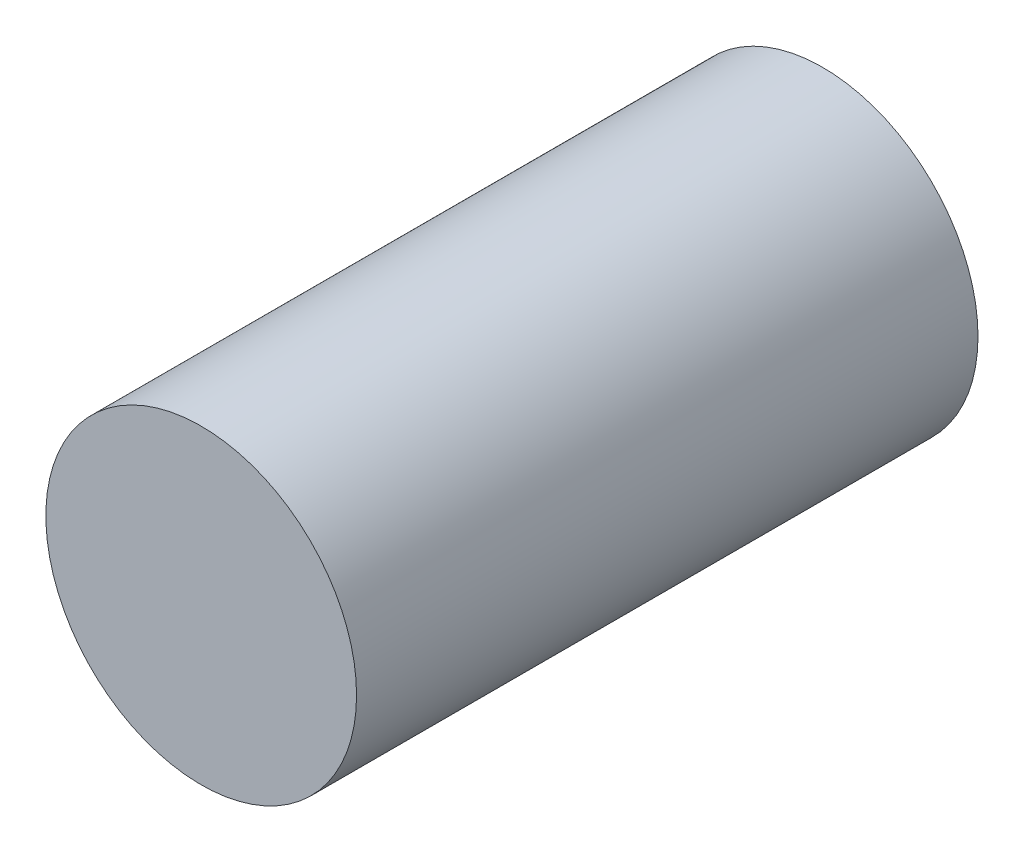
ISO-10303-21;
HEADER;
FILE_DESCRIPTION(('STEP AP214'),'2;1');
FILE_NAME('part.step','',(''),(''),'','','');
FILE_SCHEMA(('AUTOMOTIVE_DESIGN { 1 0 10303 214 1 1 1 1 }'));
ENDSEC;
DATA;
#1=APPLICATION_CONTEXT('core data for automotive mechanical design processes');
#2=APPLICATION_PROTOCOL_DEFINITION('international standard','automotive_design',2000,#1);
#3=PRODUCT_CONTEXT('',#1,'mechanical');
#4=PRODUCT('Part','Part','',(#3));
#5=PRODUCT_RELATED_PRODUCT_CATEGORY('part','',(#4));
#6=PRODUCT_DEFINITION_FORMATION('','',#4);
#7=PRODUCT_DEFINITION_CONTEXT('part definition',#1,'design');
#8=PRODUCT_DEFINITION('design','',#6,#7);
#9=PRODUCT_DEFINITION_SHAPE('','',#8);
#10=(LENGTH_UNIT() NAMED_UNIT(*) SI_UNIT(.MILLI.,.METRE.));
#11=(NAMED_UNIT(*) PLANE_ANGLE_UNIT() SI_UNIT($,.RADIAN.));
#12=(NAMED_UNIT(*) SI_UNIT($,.STERADIAN.) SOLID_ANGLE_UNIT());
#13=UNCERTAINTY_MEASURE_WITH_UNIT(LENGTH_MEASURE(1.E-05),#10,'distance_accuracy_value','');
#14=(GEOMETRIC_REPRESENTATION_CONTEXT(3) GLOBAL_UNCERTAINTY_ASSIGNED_CONTEXT((#13)) GLOBAL_UNIT_ASSIGNED_CONTEXT((#10,
#11,#12)) REPRESENTATION_CONTEXT('',''));
#15=CARTESIAN_POINT('',(0.,0.,0.));
#16=DIRECTION('',(0.,0.,1.));
#17=DIRECTION('',(1.,0.,0.));
#18=AXIS2_PLACEMENT_3D('',#15,#16,#17);
#19=CARTESIAN_POINT('',(0.,0.,1.));
#20=DIRECTION('',(0.,0.,-1.));
#21=DIRECTION('',(-1.,0.,0.));
#22=AXIS2_PLACEMENT_3D('',#19,#20,#21);
#23=CYLINDRICAL_SURFACE('',#22,0.25);
#24=CARTESIAN_POINT('',(0.,0.,1.));
#25=DIRECTION('',(0.,0.,1.));
#26=DIRECTION('',(1.,0.,0.));
#27=AXIS2_PLACEMENT_3D('',#24,#25,#26);
#28=CIRCLE('',#27,0.25);
#29=CARTESIAN_POINT('',(0.25,0.,1.));
#30=VERTEX_POINT('',#29);
#31=EDGE_CURVE('E10',#30,#30,#28,.T.);
#32=ORIENTED_EDGE('',*,*,#31,.F.);
#33=EDGE_LOOP('',(#32));
#34=FACE_BOUND('',#33,.T.);
#35=CARTESIAN_POINT('',(0.,0.,0.));
#36=DIRECTION('',(0.,0.,1.));
#37=DIRECTION('',(1.,0.,0.));
#38=AXIS2_PLACEMENT_3D('',#35,#36,#37);
#39=CIRCLE('',#38,0.25);
#40=CARTESIAN_POINT('',(0.25,0.,0.));
#41=VERTEX_POINT('',#40);
#42=EDGE_CURVE('E38',#41,#41,#39,.T.);
#43=ORIENTED_EDGE('',*,*,#42,.T.);
#44=EDGE_LOOP('',(#43));
#45=FACE_BOUND('',#44,.T.);
#46=ADVANCED_FACE('F35',(#34,#45),#23,.T.);
#47=CARTESIAN_POINT('',(0.,0.,1.));
#48=DIRECTION('',(0.,0.,1.));
#49=DIRECTION('',(1.,0.,0.));
#50=AXIS2_PLACEMENT_3D('',#47,#48,#49);
#51=PLANE('',#50);
#52=ORIENTED_EDGE('',*,*,#31,.T.);
#53=EDGE_LOOP('',(#52));
#54=FACE_BOUND('',#53,.T.);
#55=ADVANCED_FACE('F50',(#54),#51,.T.);
#56=CARTESIAN_POINT('',(0.,0.,0.));
#57=DIRECTION('',(0.,0.,1.));
#58=DIRECTION('',(1.,0.,0.));
#59=AXIS2_PLACEMENT_3D('',#56,#57,#58);
#60=PLANE('',#59);
#61=ORIENTED_EDGE('',*,*,#42,.F.);
#62=EDGE_LOOP('',(#61));
#63=FACE_BOUND('',#62,.T.);
#64=ADVANCED_FACE('F48',(#63),#60,.F.);
#65=CLOSED_SHELL('',(#46,#55,#64));
#66=MANIFOLD_SOLID_BREP('B2',#65);
#67=ADVANCED_BREP_SHAPE_REPRESENTATION('',(#18,#66),#14);
#68=SHAPE_DEFINITION_REPRESENTATION(#9,#67);
ENDSEC;
END-ISO-10303-21;
